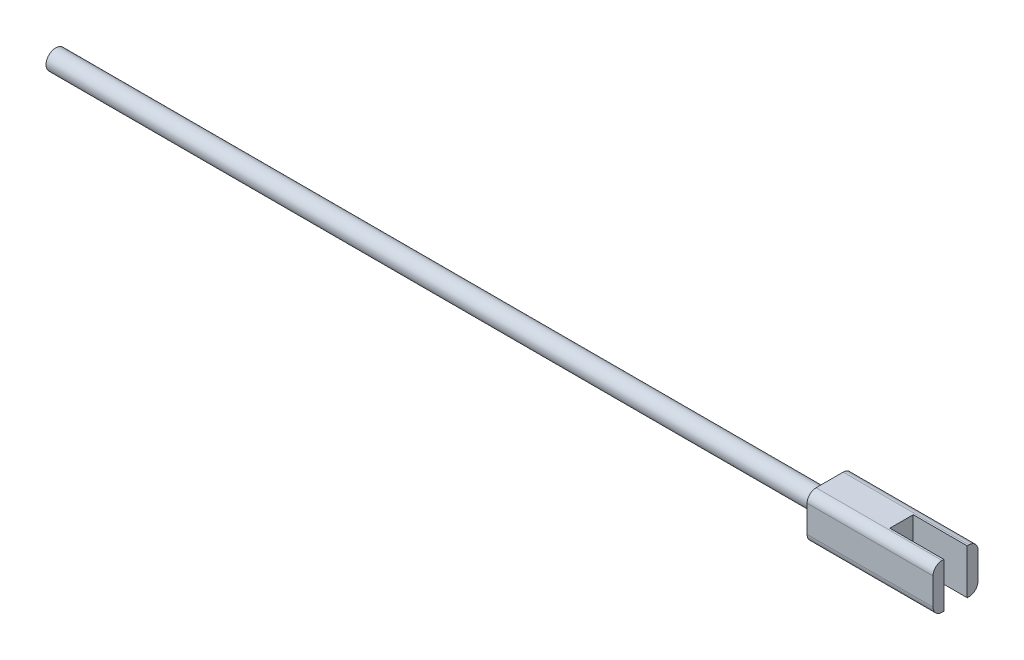
ISO-10303-21;
HEADER;
FILE_DESCRIPTION(('STEP AP214'),'2;1');
FILE_NAME('part.step','',(''),(''),'','','');
FILE_SCHEMA(('AUTOMOTIVE_DESIGN { 1 0 10303 214 1 1 1 1 }'));
ENDSEC;
DATA;
#1=APPLICATION_CONTEXT('core data for automotive mechanical design processes');
#2=APPLICATION_PROTOCOL_DEFINITION('international standard','automotive_design',2000,#1);
#3=PRODUCT_CONTEXT('',#1,'mechanical');
#4=PRODUCT('Part','Part','',(#3));
#5=PRODUCT_RELATED_PRODUCT_CATEGORY('part','',(#4));
#6=PRODUCT_DEFINITION_FORMATION('','',#4);
#7=PRODUCT_DEFINITION_CONTEXT('part definition',#1,'design');
#8=PRODUCT_DEFINITION('design','',#6,#7);
#9=PRODUCT_DEFINITION_SHAPE('','',#8);
#10=(LENGTH_UNIT() NAMED_UNIT(*) SI_UNIT(.MILLI.,.METRE.));
#11=(NAMED_UNIT(*) PLANE_ANGLE_UNIT() SI_UNIT($,.RADIAN.));
#12=(NAMED_UNIT(*) SI_UNIT($,.STERADIAN.) SOLID_ANGLE_UNIT());
#13=UNCERTAINTY_MEASURE_WITH_UNIT(LENGTH_MEASURE(1.E-05),#10,'distance_accuracy_value','');
#14=(GEOMETRIC_REPRESENTATION_CONTEXT(3) GLOBAL_UNCERTAINTY_ASSIGNED_CONTEXT((#13)) GLOBAL_UNIT_ASSIGNED_CONTEXT((#10,
#11,#12)) REPRESENTATION_CONTEXT('',''));
#15=CARTESIAN_POINT('',(0.,0.,0.));
#16=DIRECTION('',(0.,0.,1.));
#17=DIRECTION('',(1.,0.,0.));
#18=AXIS2_PLACEMENT_3D('',#15,#16,#17);
#19=CARTESIAN_POINT('',(100.041,-1.5,1.5));
#20=DIRECTION('',(1.,0.,0.));
#21=DIRECTION('',(0.,0.,-1.));
#22=AXIS2_PLACEMENT_3D('',#19,#20,#21);
#23=PLANE('',#22);
#24=DIRECTION('',(0.,1.,0.));
#25=VECTOR('',#24,1.);
#26=CARTESIAN_POINT('',(100.041,-1.5,-1.3));
#27=LINE('',#26,#25);
#28=CARTESIAN_POINT('',(100.041,-2.5,-1.3));
#29=VERTEX_POINT('',#28);
#30=CARTESIAN_POINT('',(100.041,2.5,-1.3));
#31=VERTEX_POINT('',#30);
#32=EDGE_CURVE('E11',#29,#31,#27,.T.);
#33=ORIENTED_EDGE('',*,*,#32,.F.);
#34=DIRECTION('',(0.,0.,-1.));
#35=VECTOR('',#34,1.);
#36=CARTESIAN_POINT('',(100.041,-2.5,1.5));
#37=LINE('',#36,#35);
#38=CARTESIAN_POINT('',(100.041,-2.5,-1.5));
#39=VERTEX_POINT('',#38);
#40=EDGE_CURVE('E202',#29,#39,#37,.T.);
#41=ORIENTED_EDGE('',*,*,#40,.T.);
#42=CARTESIAN_POINT('',(100.041,-1.5,-1.5));
#43=DIRECTION('',(1.,0.,0.));
#44=DIRECTION('',(0.,0.,-1.));
#45=AXIS2_PLACEMENT_3D('',#42,#43,#44);
#46=CIRCLE('',#45,1.);
#47=CARTESIAN_POINT('',(100.041,-1.5,-2.5));
#48=VERTEX_POINT('',#47);
#49=EDGE_CURVE('E201',#39,#48,#46,.T.);
#50=ORIENTED_EDGE('',*,*,#49,.T.);
#51=DIRECTION('',(0.,1.,0.));
#52=VECTOR('',#51,1.);
#53=CARTESIAN_POINT('',(100.041,-1.5,-2.5));
#54=LINE('',#53,#52);
#55=CARTESIAN_POINT('',(100.041,1.5,-2.5));
#56=VERTEX_POINT('',#55);
#57=EDGE_CURVE('E204',#48,#56,#54,.T.);
#58=ORIENTED_EDGE('',*,*,#57,.T.);
#59=CARTESIAN_POINT('',(100.041,1.5,-1.5));
#60=DIRECTION('',(1.,0.,0.));
#61=DIRECTION('',(0.,0.,-1.));
#62=AXIS2_PLACEMENT_3D('',#59,#60,#61);
#63=CIRCLE('',#62,1.);
#64=CARTESIAN_POINT('',(100.041,2.5,-1.5));
#65=VERTEX_POINT('',#64);
#66=EDGE_CURVE('E129',#56,#65,#63,.T.);
#67=ORIENTED_EDGE('',*,*,#66,.T.);
#68=DIRECTION('',(0.,0.,1.));
#69=VECTOR('',#68,1.);
#70=CARTESIAN_POINT('',(100.041,2.5,-1.5));
#71=LINE('',#70,#69);
#72=EDGE_CURVE('E128',#65,#31,#71,.T.);
#73=ORIENTED_EDGE('',*,*,#72,.T.);
#74=EDGE_LOOP('',(#33,#41,#50,#58,#67,#73));
#75=FACE_BOUND('',#74,.T.);
#76=ADVANCED_FACE('F39',(#75),#23,.T.);
#77=CARTESIAN_POINT('',(88.041,0.,0.));
#78=DIRECTION('',(-1.,0.,0.));
#79=DIRECTION('',(0.,0.,1.));
#80=AXIS2_PLACEMENT_3D('',#77,#78,#79);
#81=CYLINDRICAL_SURFACE('',#80,1.09);
#82=CARTESIAN_POINT('',(0.,0.,0.));
#83=DIRECTION('',(1.,0.,0.));
#84=DIRECTION('',(0.,0.,-1.));
#85=AXIS2_PLACEMENT_3D('',#82,#83,#84);
#86=CIRCLE('',#85,1.09);
#87=CARTESIAN_POINT('',(0.,0.,-1.09));
#88=VERTEX_POINT('',#87);
#89=EDGE_CURVE('E181',#88,#88,#86,.T.);
#90=ORIENTED_EDGE('',*,*,#89,.T.);
#91=EDGE_LOOP('',(#90));
#92=FACE_BOUND('',#91,.T.);
#93=CARTESIAN_POINT('',(86.041,0.,0.));
#94=DIRECTION('',(1.,0.,0.));
#95=DIRECTION('',(0.,0.,-1.));
#96=AXIS2_PLACEMENT_3D('',#93,#94,#95);
#97=CIRCLE('',#96,1.09);
#98=CARTESIAN_POINT('',(86.041,0.,-1.09));
#99=VERTEX_POINT('',#98);
#100=EDGE_CURVE('E184',#99,#99,#97,.T.);
#101=ORIENTED_EDGE('',*,*,#100,.F.);
#102=EDGE_LOOP('',(#101));
#103=FACE_BOUND('',#102,.T.);
#104=ADVANCED_FACE('F41',(#92,#103),#81,.T.);
#105=CARTESIAN_POINT('',(0.,0.,0.));
#106=DIRECTION('',(1.,0.,0.));
#107=DIRECTION('',(0.,0.,-1.));
#108=AXIS2_PLACEMENT_3D('',#105,#106,#107);
#109=PLANE('',#108);
#110=ORIENTED_EDGE('',*,*,#89,.F.);
#111=EDGE_LOOP('',(#110));
#112=FACE_BOUND('',#111,.T.);
#113=ADVANCED_FACE('F264',(#112),#109,.F.);
#114=CARTESIAN_POINT('',(100.041,-1.5,1.5));
#115=DIRECTION('',(-1.,0.,0.));
#116=DIRECTION('',(0.,0.,1.));
#117=AXIS2_PLACEMENT_3D('',#114,#115,#116);
#118=CYLINDRICAL_SURFACE('',#117,1.);
#119=CARTESIAN_POINT('',(86.041,-1.5,1.5));
#120=DIRECTION('',(1.,0.,0.));
#121=DIRECTION('',(0.,0.,-1.));
#122=AXIS2_PLACEMENT_3D('',#119,#120,#121);
#123=CIRCLE('',#122,1.);
#124=CARTESIAN_POINT('',(86.041,-1.5,2.5));
#125=VERTEX_POINT('',#124);
#126=CARTESIAN_POINT('',(86.041,-2.5,1.5));
#127=VERTEX_POINT('',#126);
#128=EDGE_CURVE('E150',#125,#127,#123,.T.);
#129=ORIENTED_EDGE('',*,*,#128,.T.);
#130=DIRECTION('',(-1.,0.,0.));
#131=VECTOR('',#130,1.);
#132=CARTESIAN_POINT('',(100.041,-2.5,1.5));
#133=LINE('',#132,#131);
#134=CARTESIAN_POINT('',(100.041,-2.5,1.5));
#135=VERTEX_POINT('',#134);
#136=EDGE_CURVE('E179',#135,#127,#133,.T.);
#137=ORIENTED_EDGE('',*,*,#136,.F.);
#138=CARTESIAN_POINT('',(100.041,-1.5,1.5));
#139=DIRECTION('',(1.,0.,0.));
#140=DIRECTION('',(0.,0.,-1.));
#141=AXIS2_PLACEMENT_3D('',#138,#139,#140);
#142=CIRCLE('',#141,1.);
#143=CARTESIAN_POINT('',(100.041,-1.5,2.5));
#144=VERTEX_POINT('',#143);
#145=EDGE_CURVE('E166',#144,#135,#142,.T.);
#146=ORIENTED_EDGE('',*,*,#145,.F.);
#147=DIRECTION('',(-1.,0.,0.));
#148=VECTOR('',#147,1.);
#149=CARTESIAN_POINT('',(100.041,-1.5,2.5));
#150=LINE('',#149,#148);
#151=EDGE_CURVE('E145',#144,#125,#150,.T.);
#152=ORIENTED_EDGE('',*,*,#151,.T.);
#153=EDGE_LOOP('',(#129,#137,#146,#152));
#154=FACE_BOUND('',#153,.T.);
#155=ADVANCED_FACE('F262',(#154),#118,.T.);
#156=CARTESIAN_POINT('',(100.041,-2.5,1.5));
#157=DIRECTION('',(0.,1.,0.));
#158=DIRECTION('',(0.,0.,1.));
#159=AXIS2_PLACEMENT_3D('',#156,#157,#158);
#160=PLANE('',#159);
#161=ORIENTED_EDGE('',*,*,#40,.F.);
#162=DIRECTION('',(-1.,0.,0.));
#163=VECTOR('',#162,1.);
#164=CARTESIAN_POINT('',(94.041,-2.5,-1.3));
#165=LINE('',#164,#163);
#166=CARTESIAN_POINT('',(94.041,-2.5,-1.3));
#167=VERTEX_POINT('',#166);
#168=EDGE_CURVE('E197',#29,#167,#165,.T.);
#169=ORIENTED_EDGE('',*,*,#168,.T.);
#170=DIRECTION('',(0.,0.,1.));
#171=VECTOR('',#170,1.);
#172=CARTESIAN_POINT('',(94.041,-2.5,1.3));
#173=LINE('',#172,#171);
#174=CARTESIAN_POINT('',(94.041,-2.5,1.3));
#175=VERTEX_POINT('',#174);
#176=EDGE_CURVE('E196',#167,#175,#173,.T.);
#177=ORIENTED_EDGE('',*,*,#176,.T.);
#178=DIRECTION('',(1.,0.,0.));
#179=VECTOR('',#178,1.);
#180=CARTESIAN_POINT('',(101.041,-2.5,1.3));
#181=LINE('',#180,#179);
#182=CARTESIAN_POINT('',(100.041,-2.5,1.3));
#183=VERTEX_POINT('',#182);
#184=EDGE_CURVE('E189',#175,#183,#181,.T.);
#185=ORIENTED_EDGE('',*,*,#184,.T.);
#186=EDGE_CURVE('E105',#135,#183,#37,.T.);
#187=ORIENTED_EDGE('',*,*,#186,.F.);
#188=ORIENTED_EDGE('',*,*,#136,.T.);
#189=DIRECTION('',(0.,0.,-1.));
#190=VECTOR('',#189,1.);
#191=CARTESIAN_POINT('',(86.041,-2.5,1.5));
#192=LINE('',#191,#190);
#193=CARTESIAN_POINT('',(86.041,-2.5,-1.5));
#194=VERTEX_POINT('',#193);
#195=EDGE_CURVE('E153',#127,#194,#192,.T.);
#196=ORIENTED_EDGE('',*,*,#195,.T.);
#197=DIRECTION('',(-1.,0.,0.));
#198=VECTOR('',#197,1.);
#199=CARTESIAN_POINT('',(100.041,-2.5,-1.5));
#200=LINE('',#199,#198);
#201=EDGE_CURVE('E176',#39,#194,#200,.T.);
#202=ORIENTED_EDGE('',*,*,#201,.F.);
#203=EDGE_LOOP('',(#161,#169,#177,#185,#187,#188,#196,#202));
#204=FACE_BOUND('',#203,.T.);
#205=ADVANCED_FACE('F193',(#204),#160,.F.);
#206=CARTESIAN_POINT('',(100.041,-1.5,-1.5));
#207=DIRECTION('',(-1.,0.,0.));
#208=DIRECTION('',(0.,0.,1.));
#209=AXIS2_PLACEMENT_3D('',#206,#207,#208);
#210=CYLINDRICAL_SURFACE('',#209,1.);
#211=CARTESIAN_POINT('',(86.041,-1.5,-1.5));
#212=DIRECTION('',(1.,0.,0.));
#213=DIRECTION('',(0.,0.,-1.));
#214=AXIS2_PLACEMENT_3D('',#211,#212,#213);
#215=CIRCLE('',#214,1.);
#216=CARTESIAN_POINT('',(86.041,-1.5,-2.5));
#217=VERTEX_POINT('',#216);
#218=EDGE_CURVE('E156',#194,#217,#215,.T.);
#219=ORIENTED_EDGE('',*,*,#218,.T.);
#220=DIRECTION('',(-1.,0.,0.));
#221=VECTOR('',#220,1.);
#222=CARTESIAN_POINT('',(100.041,-1.5,-2.5));
#223=LINE('',#222,#221);
#224=EDGE_CURVE('E173',#48,#217,#223,.T.);
#225=ORIENTED_EDGE('',*,*,#224,.F.);
#226=ORIENTED_EDGE('',*,*,#49,.F.);
#227=ORIENTED_EDGE('',*,*,#201,.T.);
#228=EDGE_LOOP('',(#219,#225,#226,#227));
#229=FACE_BOUND('',#228,.T.);
#230=ADVANCED_FACE('F253',(#229),#210,.T.);
#231=CARTESIAN_POINT('',(100.041,-1.5,-2.5));
#232=DIRECTION('',(0.,0.,1.));
#233=DIRECTION('',(1.,0.,0.));
#234=AXIS2_PLACEMENT_3D('',#231,#232,#233);
#235=PLANE('',#234);
#236=DIRECTION('',(0.,1.,0.));
#237=VECTOR('',#236,1.);
#238=CARTESIAN_POINT('',(86.041,-1.5,-2.5));
#239=LINE('',#238,#237);
#240=CARTESIAN_POINT('',(86.041,1.5,-2.5));
#241=VERTEX_POINT('',#240);
#242=EDGE_CURVE('E158',#217,#241,#239,.T.);
#243=ORIENTED_EDGE('',*,*,#242,.T.);
#244=DIRECTION('',(-1.,0.,0.));
#245=VECTOR('',#244,1.);
#246=CARTESIAN_POINT('',(100.041,1.5,-2.5));
#247=LINE('',#246,#245);
#248=EDGE_CURVE('E170',#56,#241,#247,.T.);
#249=ORIENTED_EDGE('',*,*,#248,.F.);
#250=ORIENTED_EDGE('',*,*,#57,.F.);
#251=ORIENTED_EDGE('',*,*,#224,.T.);
#252=EDGE_LOOP('',(#243,#249,#250,#251));
#253=FACE_BOUND('',#252,.T.);
#254=ADVANCED_FACE('F256',(#253),#235,.F.);
#255=CARTESIAN_POINT('',(100.041,1.5,-1.5));
#256=DIRECTION('',(-1.,0.,0.));
#257=DIRECTION('',(0.,0.,1.));
#258=AXIS2_PLACEMENT_3D('',#255,#256,#257);
#259=CYLINDRICAL_SURFACE('',#258,1.);
#260=CARTESIAN_POINT('',(86.041,1.5,-1.5));
#261=DIRECTION('',(1.,0.,0.));
#262=DIRECTION('',(0.,0.,-1.));
#263=AXIS2_PLACEMENT_3D('',#260,#261,#262);
#264=CIRCLE('',#263,1.);
#265=CARTESIAN_POINT('',(86.041,2.5,-1.5));
#266=VERTEX_POINT('',#265);
#267=EDGE_CURVE('E160',#241,#266,#264,.T.);
#268=ORIENTED_EDGE('',*,*,#267,.T.);
#269=DIRECTION('',(-1.,0.,0.));
#270=VECTOR('',#269,1.);
#271=CARTESIAN_POINT('',(100.041,2.5,-1.5));
#272=LINE('',#271,#270);
#273=EDGE_CURVE('E140',#65,#266,#272,.T.);
#274=ORIENTED_EDGE('',*,*,#273,.F.);
#275=ORIENTED_EDGE('',*,*,#66,.F.);
#276=ORIENTED_EDGE('',*,*,#248,.T.);
#277=EDGE_LOOP('',(#268,#274,#275,#276));
#278=FACE_BOUND('',#277,.T.);
#279=ADVANCED_FACE('F218',(#278),#259,.T.);
#280=CARTESIAN_POINT('',(100.041,2.5,-1.5));
#281=DIRECTION('',(0.,-1.,0.));
#282=DIRECTION('',(0.,0.,-1.));
#283=AXIS2_PLACEMENT_3D('',#280,#281,#282);
#284=PLANE('',#283);
#285=DIRECTION('',(0.,0.,1.));
#286=VECTOR('',#285,1.);
#287=CARTESIAN_POINT('',(94.041,2.5,1.3));
#288=LINE('',#287,#286);
#289=CARTESIAN_POINT('',(94.041,2.5,-1.3));
#290=VERTEX_POINT('',#289);
#291=CARTESIAN_POINT('',(94.041,2.5,1.3));
#292=VERTEX_POINT('',#291);
#293=EDGE_CURVE('E225',#290,#292,#288,.T.);
#294=ORIENTED_EDGE('',*,*,#293,.F.);
#295=DIRECTION('',(-1.,0.,0.));
#296=VECTOR('',#295,1.);
#297=CARTESIAN_POINT('',(94.041,2.5,-1.3));
#298=LINE('',#297,#296);
#299=EDGE_CURVE('E222',#31,#290,#298,.T.);
#300=ORIENTED_EDGE('',*,*,#299,.F.);
#301=ORIENTED_EDGE('',*,*,#72,.F.);
#302=ORIENTED_EDGE('',*,*,#273,.T.);
#303=DIRECTION('',(0.,0.,1.));
#304=VECTOR('',#303,1.);
#305=CARTESIAN_POINT('',(86.041,2.5,-1.5));
#306=LINE('',#305,#304);
#307=CARTESIAN_POINT('',(86.041,2.5,1.5));
#308=VERTEX_POINT('',#307);
#309=EDGE_CURVE('E137',#266,#308,#306,.T.);
#310=ORIENTED_EDGE('',*,*,#309,.T.);
#311=DIRECTION('',(-1.,0.,0.));
#312=VECTOR('',#311,1.);
#313=CARTESIAN_POINT('',(100.041,2.5,1.5));
#314=LINE('',#313,#312);
#315=CARTESIAN_POINT('',(100.041,2.5,1.5));
#316=VERTEX_POINT('',#315);
#317=EDGE_CURVE('E132',#316,#308,#314,.T.);
#318=ORIENTED_EDGE('',*,*,#317,.F.);
#319=CARTESIAN_POINT('',(100.041,2.5,1.3));
#320=VERTEX_POINT('',#319);
#321=EDGE_CURVE('E121',#320,#316,#71,.T.);
#322=ORIENTED_EDGE('',*,*,#321,.F.);
#323=DIRECTION('',(1.,0.,0.));
#324=VECTOR('',#323,1.);
#325=CARTESIAN_POINT('',(101.041,2.5,1.3));
#326=LINE('',#325,#324);
#327=EDGE_CURVE('E54',#292,#320,#326,.T.);
#328=ORIENTED_EDGE('',*,*,#327,.F.);
#329=EDGE_LOOP('',(#294,#300,#301,#302,#310,#318,#322,#328));
#330=FACE_BOUND('',#329,.T.);
#331=ADVANCED_FACE('F134',(#330),#284,.F.);
#332=CARTESIAN_POINT('',(100.041,1.5,1.5));
#333=DIRECTION('',(-1.,0.,0.));
#334=DIRECTION('',(0.,0.,1.));
#335=AXIS2_PLACEMENT_3D('',#332,#333,#334);
#336=CYLINDRICAL_SURFACE('',#335,1.);
#337=CARTESIAN_POINT('',(86.041,1.5,1.5));
#338=DIRECTION('',(1.,0.,0.));
#339=DIRECTION('',(0.,0.,-1.));
#340=AXIS2_PLACEMENT_3D('',#337,#338,#339);
#341=CIRCLE('',#340,1.);
#342=CARTESIAN_POINT('',(86.041,1.5,2.5));
#343=VERTEX_POINT('',#342);
#344=EDGE_CURVE('E163',#308,#343,#341,.T.);
#345=ORIENTED_EDGE('',*,*,#344,.T.);
#346=DIRECTION('',(-1.,0.,0.));
#347=VECTOR('',#346,1.);
#348=CARTESIAN_POINT('',(100.041,1.5,2.5));
#349=LINE('',#348,#347);
#350=CARTESIAN_POINT('',(100.041,1.5,2.5));
#351=VERTEX_POINT('',#350);
#352=EDGE_CURVE('E141',#351,#343,#349,.T.);
#353=ORIENTED_EDGE('',*,*,#352,.F.);
#354=CARTESIAN_POINT('',(100.041,1.5,1.5));
#355=DIRECTION('',(1.,0.,0.));
#356=DIRECTION('',(0.,0.,-1.));
#357=AXIS2_PLACEMENT_3D('',#354,#355,#356);
#358=CIRCLE('',#357,1.);
#359=EDGE_CURVE('E125',#316,#351,#358,.T.);
#360=ORIENTED_EDGE('',*,*,#359,.F.);
#361=ORIENTED_EDGE('',*,*,#317,.T.);
#362=EDGE_LOOP('',(#345,#353,#360,#361));
#363=FACE_BOUND('',#362,.T.);
#364=ADVANCED_FACE('F143',(#363),#336,.T.);
#365=CARTESIAN_POINT('',(100.041,1.5,2.5));
#366=DIRECTION('',(0.,0.,-1.));
#367=DIRECTION('',(-1.,0.,0.));
#368=AXIS2_PLACEMENT_3D('',#365,#366,#367);
#369=PLANE('',#368);
#370=DIRECTION('',(0.,-1.,0.));
#371=VECTOR('',#370,1.);
#372=CARTESIAN_POINT('',(86.041,1.5,2.5));
#373=LINE('',#372,#371);
#374=EDGE_CURVE('E96',#343,#125,#373,.T.);
#375=ORIENTED_EDGE('',*,*,#374,.T.);
#376=ORIENTED_EDGE('',*,*,#151,.F.);
#377=DIRECTION('',(0.,-1.,0.));
#378=VECTOR('',#377,1.);
#379=CARTESIAN_POINT('',(100.041,1.5,2.5));
#380=LINE('',#379,#378);
#381=EDGE_CURVE('E63',#351,#144,#380,.T.);
#382=ORIENTED_EDGE('',*,*,#381,.F.);
#383=ORIENTED_EDGE('',*,*,#352,.T.);
#384=EDGE_LOOP('',(#375,#376,#382,#383));
#385=FACE_BOUND('',#384,.T.);
#386=ADVANCED_FACE('F260',(#385),#369,.F.);
#387=DIRECTION('',(0.,-1.,0.));
#388=VECTOR('',#387,1.);
#389=CARTESIAN_POINT('',(100.041,-1.5,1.3));
#390=LINE('',#389,#388);
#391=EDGE_CURVE('E47',#320,#183,#390,.T.);
#392=ORIENTED_EDGE('',*,*,#391,.F.);
#393=ORIENTED_EDGE('',*,*,#321,.T.);
#394=ORIENTED_EDGE('',*,*,#359,.T.);
#395=ORIENTED_EDGE('',*,*,#381,.T.);
#396=ORIENTED_EDGE('',*,*,#145,.T.);
#397=ORIENTED_EDGE('',*,*,#186,.T.);
#398=EDGE_LOOP('',(#392,#393,#394,#395,#396,#397));
#399=FACE_BOUND('',#398,.T.);
#400=ADVANCED_FACE('F123',(#399),#23,.T.);
#401=CARTESIAN_POINT('',(86.041,-1.5,1.5));
#402=DIRECTION('',(1.,0.,0.));
#403=DIRECTION('',(0.,0.,-1.));
#404=AXIS2_PLACEMENT_3D('',#401,#402,#403);
#405=PLANE('',#404);
#406=ORIENTED_EDGE('',*,*,#100,.T.);
#407=EDGE_LOOP('',(#406));
#408=FACE_BOUND('',#407,.T.);
#409=ORIENTED_EDGE('',*,*,#128,.F.);
#410=ORIENTED_EDGE('',*,*,#374,.F.);
#411=ORIENTED_EDGE('',*,*,#344,.F.);
#412=ORIENTED_EDGE('',*,*,#309,.F.);
#413=ORIENTED_EDGE('',*,*,#267,.F.);
#414=ORIENTED_EDGE('',*,*,#242,.F.);
#415=ORIENTED_EDGE('',*,*,#218,.F.);
#416=ORIENTED_EDGE('',*,*,#195,.F.);
#417=EDGE_LOOP('',(#409,#410,#411,#412,#413,#414,#415,#416));
#418=FACE_BOUND('',#417,.T.);
#419=ADVANCED_FACE('F259',(#408,#418),#405,.F.);
#420=CARTESIAN_POINT('',(94.041,-2.5,1.3));
#421=DIRECTION('',(-1.,0.,0.));
#422=DIRECTION('',(0.,0.,1.));
#423=AXIS2_PLACEMENT_3D('',#420,#421,#422);
#424=PLANE('',#423);
#425=DIRECTION('',(0.,1.,0.));
#426=VECTOR('',#425,1.);
#427=CARTESIAN_POINT('',(94.041,-2.5,1.3));
#428=LINE('',#427,#426);
#429=EDGE_CURVE('E237',#175,#292,#428,.T.);
#430=ORIENTED_EDGE('',*,*,#429,.F.);
#431=ORIENTED_EDGE('',*,*,#176,.F.);
#432=DIRECTION('',(0.,1.,0.));
#433=VECTOR('',#432,1.);
#434=CARTESIAN_POINT('',(94.041,-2.5,-1.3));
#435=LINE('',#434,#433);
#436=EDGE_CURVE('E154',#167,#290,#435,.T.);
#437=ORIENTED_EDGE('',*,*,#436,.T.);
#438=ORIENTED_EDGE('',*,*,#293,.T.);
#439=EDGE_LOOP('',(#430,#431,#437,#438));
#440=FACE_BOUND('',#439,.T.);
#441=ADVANCED_FACE('F242',(#440),#424,.F.);
#442=CARTESIAN_POINT('',(94.041,-2.5,-1.3));
#443=DIRECTION('',(0.,0.,-1.));
#444=DIRECTION('',(-1.,0.,0.));
#445=AXIS2_PLACEMENT_3D('',#442,#443,#444);
#446=PLANE('',#445);
#447=ORIENTED_EDGE('',*,*,#32,.T.);
#448=ORIENTED_EDGE('',*,*,#299,.T.);
#449=ORIENTED_EDGE('',*,*,#436,.F.);
#450=ORIENTED_EDGE('',*,*,#168,.F.);
#451=EDGE_LOOP('',(#447,#448,#449,#450));
#452=FACE_BOUND('',#451,.T.);
#453=ADVANCED_FACE('F245',(#452),#446,.F.);
#454=CARTESIAN_POINT('',(101.041,-2.5,1.3));
#455=DIRECTION('',(0.,0.,1.));
#456=DIRECTION('',(1.,0.,0.));
#457=AXIS2_PLACEMENT_3D('',#454,#455,#456);
#458=PLANE('',#457);
#459=ORIENTED_EDGE('',*,*,#391,.T.);
#460=ORIENTED_EDGE('',*,*,#184,.F.);
#461=ORIENTED_EDGE('',*,*,#429,.T.);
#462=ORIENTED_EDGE('',*,*,#327,.T.);
#463=EDGE_LOOP('',(#459,#460,#461,#462));
#464=FACE_BOUND('',#463,.T.);
#465=ADVANCED_FACE('F187',(#464),#458,.F.);
#466=CLOSED_SHELL('',(#76,#104,#113,#155,#205,#230,#254,#279,#331,#364,#386,#400,#419,#441,#453,#465));
#467=MANIFOLD_SOLID_BREP('B2',#466);
#468=ADVANCED_BREP_SHAPE_REPRESENTATION('',(#18,#467),#14);
#469=SHAPE_DEFINITION_REPRESENTATION(#9,#468);
ENDSEC;
END-ISO-10303-21;
